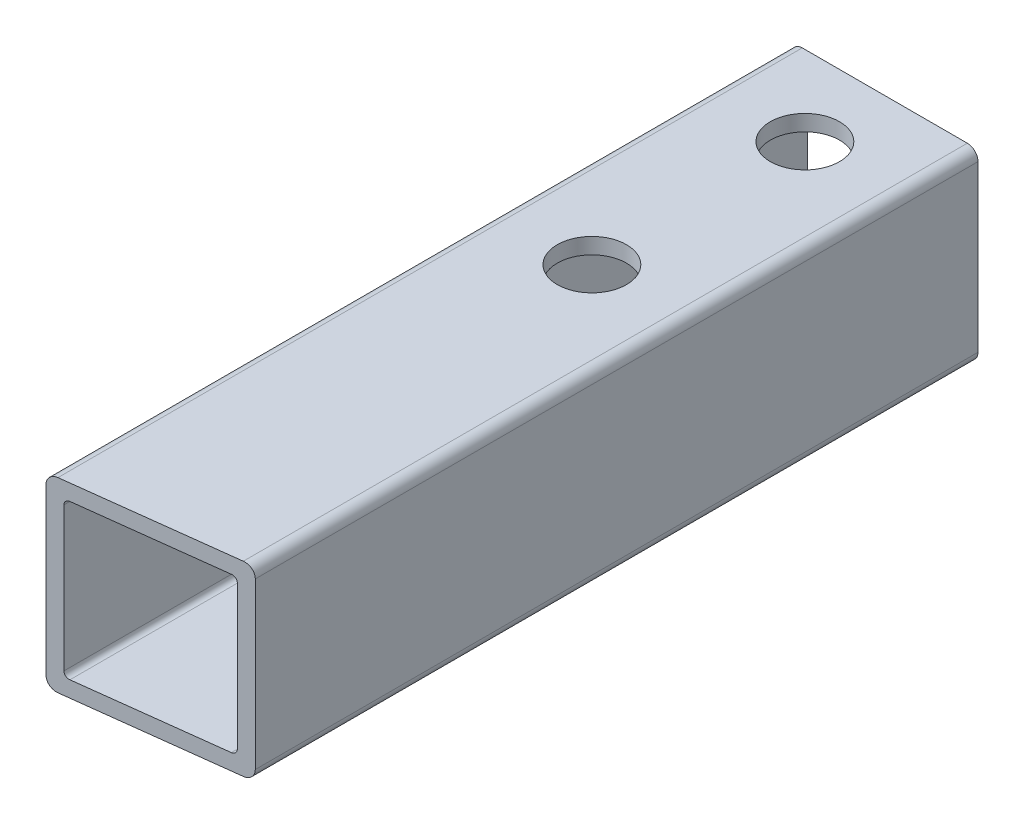
ISO-10303-21;
HEADER;
FILE_DESCRIPTION(('STEP AP214'),'2;1');
FILE_NAME('part.step','',(''),(''),'','','');
FILE_SCHEMA(('AUTOMOTIVE_DESIGN { 1 0 10303 214 1 1 1 1 }'));
ENDSEC;
DATA;
#1=APPLICATION_CONTEXT('core data for automotive mechanical design processes');
#2=APPLICATION_PROTOCOL_DEFINITION('international standard','automotive_design',2000,#1);
#3=PRODUCT_CONTEXT('',#1,'mechanical');
#4=PRODUCT('Part','Part','',(#3));
#5=PRODUCT_RELATED_PRODUCT_CATEGORY('part','',(#4));
#6=PRODUCT_DEFINITION_FORMATION('','',#4);
#7=PRODUCT_DEFINITION_CONTEXT('part definition',#1,'design');
#8=PRODUCT_DEFINITION('design','',#6,#7);
#9=PRODUCT_DEFINITION_SHAPE('','',#8);
#10=(LENGTH_UNIT() NAMED_UNIT(*) SI_UNIT(.MILLI.,.METRE.));
#11=(NAMED_UNIT(*) PLANE_ANGLE_UNIT() SI_UNIT($,.RADIAN.));
#12=(NAMED_UNIT(*) SI_UNIT($,.STERADIAN.) SOLID_ANGLE_UNIT());
#13=UNCERTAINTY_MEASURE_WITH_UNIT(LENGTH_MEASURE(1.E-05),#10,'distance_accuracy_value','');
#14=(GEOMETRIC_REPRESENTATION_CONTEXT(3) GLOBAL_UNCERTAINTY_ASSIGNED_CONTEXT((#13)) GLOBAL_UNIT_ASSIGNED_CONTEXT((#10,
#11,#12)) REPRESENTATION_CONTEXT('',''));
#15=CARTESIAN_POINT('',(0.,0.,0.));
#16=DIRECTION('',(0.,0.,1.));
#17=DIRECTION('',(1.,0.,0.));
#18=AXIS2_PLACEMENT_3D('',#15,#16,#17);
#19=CARTESIAN_POINT('',(-15.5,2.,0.));
#20=DIRECTION('',(0.,0.,1.));
#21=DIRECTION('',(1.,0.,0.));
#22=AXIS2_PLACEMENT_3D('',#19,#20,#21);
#23=PLANE('',#22);
#24=CARTESIAN_POINT('',(-15.5,2.,0.));
#25=DIRECTION('',(0.,0.,1.));
#26=DIRECTION('',(1.,0.,0.));
#27=AXIS2_PLACEMENT_3D('',#24,#25,#26);
#28=CIRCLE('',#27,2.);
#29=CARTESIAN_POINT('',(-17.5,2.,0.));
#30=VERTEX_POINT('',#29);
#31=CARTESIAN_POINT('',(-15.5,0.,0.));
#32=VERTEX_POINT('',#31);
#33=EDGE_CURVE('E255',#30,#32,#28,.T.);
#34=ORIENTED_EDGE('',*,*,#33,.F.);
#35=DIRECTION('',(0.,-1.,0.));
#36=VECTOR('',#35,1.);
#37=CARTESIAN_POINT('',(-17.5,2.,0.));
#38=LINE('',#37,#36);
#39=CARTESIAN_POINT('',(-17.5,33.,0.));
#40=VERTEX_POINT('',#39);
#41=EDGE_CURVE('E259',#40,#30,#38,.T.);
#42=ORIENTED_EDGE('',*,*,#41,.F.);
#43=CARTESIAN_POINT('',(-15.5,33.,0.));
#44=DIRECTION('',(0.,0.,1.));
#45=DIRECTION('',(1.,0.,0.));
#46=AXIS2_PLACEMENT_3D('',#43,#44,#45);
#47=CIRCLE('',#46,2.);
#48=CARTESIAN_POINT('',(-15.5,35.,0.));
#49=VERTEX_POINT('',#48);
#50=EDGE_CURVE('E274',#49,#40,#47,.T.);
#51=ORIENTED_EDGE('',*,*,#50,.F.);
#52=DIRECTION('',(-1.,0.,0.));
#53=VECTOR('',#52,1.);
#54=CARTESIAN_POINT('',(-15.5,35.,0.));
#55=LINE('',#54,#53);
#56=CARTESIAN_POINT('',(15.5,35.,0.));
#57=VERTEX_POINT('',#56);
#58=EDGE_CURVE('E272',#57,#49,#55,.T.);
#59=ORIENTED_EDGE('',*,*,#58,.F.);
#60=CARTESIAN_POINT('',(15.5,33.,0.));
#61=DIRECTION('',(0.,0.,1.));
#62=DIRECTION('',(1.,0.,0.));
#63=AXIS2_PLACEMENT_3D('',#60,#61,#62);
#64=CIRCLE('',#63,2.);
#65=CARTESIAN_POINT('',(17.5,33.,0.));
#66=VERTEX_POINT('',#65);
#67=EDGE_CURVE('E174',#66,#57,#64,.T.);
#68=ORIENTED_EDGE('',*,*,#67,.F.);
#69=DIRECTION('',(0.,1.,0.));
#70=VECTOR('',#69,1.);
#71=CARTESIAN_POINT('',(17.5,2.00000000000001,0.));
#72=LINE('',#71,#70);
#73=CARTESIAN_POINT('',(17.5,2.00000000000001,0.));
#74=VERTEX_POINT('',#73);
#75=EDGE_CURVE('E268',#74,#66,#72,.T.);
#76=ORIENTED_EDGE('',*,*,#75,.F.);
#77=CARTESIAN_POINT('',(15.5,2.00000000000001,0.));
#78=DIRECTION('',(0.,0.,1.));
#79=DIRECTION('',(1.,0.,0.));
#80=AXIS2_PLACEMENT_3D('',#77,#78,#79);
#81=CIRCLE('',#80,2.);
#82=CARTESIAN_POINT('',(15.5,0.,0.));
#83=VERTEX_POINT('',#82);
#84=EDGE_CURVE('E265',#83,#74,#81,.T.);
#85=ORIENTED_EDGE('',*,*,#84,.F.);
#86=DIRECTION('',(1.,0.,0.));
#87=VECTOR('',#86,1.);
#88=CARTESIAN_POINT('',(-15.5,0.,0.));
#89=LINE('',#88,#87);
#90=EDGE_CURVE('E262',#32,#83,#89,.T.);
#91=ORIENTED_EDGE('',*,*,#90,.F.);
#92=EDGE_LOOP('',(#34,#42,#51,#59,#68,#76,#85,#91));
#93=FACE_BOUND('',#92,.T.);
#94=CARTESIAN_POINT('',(-13.5,4.,0.));
#95=DIRECTION('',(0.,0.,1.));
#96=DIRECTION('',(1.,0.,0.));
#97=AXIS2_PLACEMENT_3D('',#94,#95,#96);
#98=CIRCLE('',#97,1.);
#99=CARTESIAN_POINT('',(-14.5,4.,0.));
#100=VERTEX_POINT('',#99);
#101=CARTESIAN_POINT('',(-13.5,3.,0.));
#102=VERTEX_POINT('',#101);
#103=EDGE_CURVE('E216',#100,#102,#98,.T.);
#104=ORIENTED_EDGE('',*,*,#103,.T.);
#105=DIRECTION('',(1.,0.,0.));
#106=VECTOR('',#105,1.);
#107=CARTESIAN_POINT('',(-13.5,3.,0.));
#108=LINE('',#107,#106);
#109=CARTESIAN_POINT('',(13.5,3.,0.));
#110=VERTEX_POINT('',#109);
#111=EDGE_CURVE('E219',#102,#110,#108,.T.);
#112=ORIENTED_EDGE('',*,*,#111,.T.);
#113=CARTESIAN_POINT('',(13.5,4.,0.));
#114=DIRECTION('',(0.,0.,1.));
#115=DIRECTION('',(1.,0.,0.));
#116=AXIS2_PLACEMENT_3D('',#113,#114,#115);
#117=CIRCLE('',#116,1.);
#118=CARTESIAN_POINT('',(14.5,4.,0.));
#119=VERTEX_POINT('',#118);
#120=EDGE_CURVE('E222',#110,#119,#117,.T.);
#121=ORIENTED_EDGE('',*,*,#120,.T.);
#122=DIRECTION('',(0.,1.,0.));
#123=VECTOR('',#122,1.);
#124=CARTESIAN_POINT('',(14.5,4.,0.));
#125=LINE('',#124,#123);
#126=CARTESIAN_POINT('',(14.5,31.,0.));
#127=VERTEX_POINT('',#126);
#128=EDGE_CURVE('E225',#119,#127,#125,.T.);
#129=ORIENTED_EDGE('',*,*,#128,.T.);
#130=CARTESIAN_POINT('',(13.5,31.,0.));
#131=DIRECTION('',(0.,0.,1.));
#132=DIRECTION('',(1.,0.,0.));
#133=AXIS2_PLACEMENT_3D('',#130,#131,#132);
#134=CIRCLE('',#133,1.);
#135=CARTESIAN_POINT('',(13.5,32.,0.));
#136=VERTEX_POINT('',#135);
#137=EDGE_CURVE('E228',#127,#136,#134,.T.);
#138=ORIENTED_EDGE('',*,*,#137,.T.);
#139=DIRECTION('',(-1.,0.,0.));
#140=VECTOR('',#139,1.);
#141=CARTESIAN_POINT('',(-13.5,32.,0.));
#142=LINE('',#141,#140);
#143=CARTESIAN_POINT('',(-13.5,32.,0.));
#144=VERTEX_POINT('',#143);
#145=EDGE_CURVE('E231',#136,#144,#142,.T.);
#146=ORIENTED_EDGE('',*,*,#145,.T.);
#147=CARTESIAN_POINT('',(-13.5,31.,0.));
#148=DIRECTION('',(0.,0.,1.));
#149=DIRECTION('',(1.,0.,0.));
#150=AXIS2_PLACEMENT_3D('',#147,#148,#149);
#151=CIRCLE('',#150,1.);
#152=CARTESIAN_POINT('',(-14.5,31.,0.));
#153=VERTEX_POINT('',#152);
#154=EDGE_CURVE('E234',#144,#153,#151,.T.);
#155=ORIENTED_EDGE('',*,*,#154,.T.);
#156=DIRECTION('',(0.,-1.,0.));
#157=VECTOR('',#156,1.);
#158=CARTESIAN_POINT('',(-14.5,4.,0.));
#159=LINE('',#158,#157);
#160=EDGE_CURVE('E237',#153,#100,#159,.T.);
#161=ORIENTED_EDGE('',*,*,#160,.T.);
#162=EDGE_LOOP('',(#104,#112,#121,#129,#138,#146,#155,#161));
#163=FACE_BOUND('',#162,.T.);
#164=ADVANCED_FACE('F36',(#93,#163),#23,.F.);
#165=CARTESIAN_POINT('',(-15.5,2.,140.));
#166=DIRECTION('',(0.,0.,-1.));
#167=DIRECTION('',(-1.,0.,0.));
#168=AXIS2_PLACEMENT_3D('',#165,#166,#167);
#169=CYLINDRICAL_SURFACE('',#168,2.);
#170=DIRECTION('',(0.,0.,-1.));
#171=VECTOR('',#170,1.);
#172=CARTESIAN_POINT('',(-15.5,0.,140.));
#173=LINE('',#172,#171);
#174=CARTESIAN_POINT('',(-15.5,0.,139.754430878194));
#175=VERTEX_POINT('',#174);
#176=EDGE_CURVE('E45',#175,#32,#173,.T.);
#177=ORIENTED_EDGE('',*,*,#176,.F.);
#178=CARTESIAN_POINT('',(-15.5,2.,139.754430878194));
#179=DIRECTION('',(-0.121869343405148,0.,-0.992546151641322));
#180=DIRECTION('',(0.992546151641322,0.,-0.121869343405148));
#181=AXIS2_PLACEMENT_3D('',#178,#179,#180);
#182=ELLIPSE('',#181,2.0150196509177,2.);
#183=CARTESIAN_POINT('',(-17.5,2.,140.));
#184=VERTEX_POINT('',#183);
#185=EDGE_CURVE('E190',#175,#184,#182,.T.);
#186=ORIENTED_EDGE('',*,*,#185,.T.);
#187=DIRECTION('',(0.,0.,-1.));
#188=VECTOR('',#187,1.);
#189=CARTESIAN_POINT('',(-17.5,2.,140.));
#190=LINE('',#189,#188);
#191=EDGE_CURVE('E258',#184,#30,#190,.T.);
#192=ORIENTED_EDGE('',*,*,#191,.T.);
#193=ORIENTED_EDGE('',*,*,#33,.T.);
#194=EDGE_LOOP('',(#177,#186,#192,#193));
#195=FACE_BOUND('',#194,.T.);
#196=ADVANCED_FACE('F38',(#195),#169,.T.);
#197=CARTESIAN_POINT('',(-15.5,0.,140.));
#198=DIRECTION('',(0.,1.,0.));
#199=DIRECTION('',(-1.,0.,0.));
#200=AXIS2_PLACEMENT_3D('',#197,#198,#199);
#201=PLANE('',#200);
#202=CARTESIAN_POINT('',(0.,0.,15.));
#203=DIRECTION('',(0.,1.,0.));
#204=DIRECTION('',(-1.,0.,0.));
#205=AXIS2_PLACEMENT_3D('',#202,#203,#204);
#206=CIRCLE('',#205,6.5);
#207=CARTESIAN_POINT('',(-6.5,0.,15.));
#208=VERTEX_POINT('',#207);
#209=EDGE_CURVE('E213',#208,#208,#206,.T.);
#210=ORIENTED_EDGE('',*,*,#209,.T.);
#211=EDGE_LOOP('',(#210));
#212=FACE_BOUND('',#211,.T.);
#213=CARTESIAN_POINT('',(0.,0.,55.));
#214=DIRECTION('',(0.,1.,0.));
#215=DIRECTION('',(-1.,0.,0.));
#216=AXIS2_PLACEMENT_3D('',#213,#214,#215);
#217=CIRCLE('',#216,6.5);
#218=CARTESIAN_POINT('',(-6.5,0.,55.));
#219=VERTEX_POINT('',#218);
#220=EDGE_CURVE('E194',#219,#219,#217,.T.);
#221=ORIENTED_EDGE('',*,*,#220,.T.);
#222=EDGE_LOOP('',(#221));
#223=FACE_BOUND('',#222,.T.);
#224=DIRECTION('',(0.,0.,-1.));
#225=VECTOR('',#224,1.);
#226=CARTESIAN_POINT('',(15.5,0.,140.));
#227=LINE('',#226,#225);
#228=CARTESIAN_POINT('',(15.5,0.,135.948109490204));
#229=VERTEX_POINT('',#228);
#230=EDGE_CURVE('E185',#229,#83,#227,.T.);
#231=ORIENTED_EDGE('',*,*,#230,.F.);
#232=DIRECTION('',(-0.992546151641322,0.,0.121869343405148));
#233=VECTOR('',#232,1.);
#234=CARTESIAN_POINT('',(-15.529704273724,0.,139.7580781044));
#235=LINE('',#234,#233);
#236=EDGE_CURVE('E197',#229,#175,#235,.T.);
#237=ORIENTED_EDGE('',*,*,#236,.T.);
#238=ORIENTED_EDGE('',*,*,#176,.T.);
#239=ORIENTED_EDGE('',*,*,#90,.T.);
#240=EDGE_LOOP('',(#231,#237,#238,#239));
#241=FACE_BOUND('',#240,.T.);
#242=ADVANCED_FACE('F292',(#212,#223,#241),#201,.F.);
#243=CARTESIAN_POINT('',(15.5,2.00000000000001,140.));
#244=DIRECTION('',(0.,0.,-1.));
#245=DIRECTION('',(-1.,0.,0.));
#246=AXIS2_PLACEMENT_3D('',#243,#244,#245);
#247=CYLINDRICAL_SURFACE('',#246,2.);
#248=DIRECTION('',(0.,0.,-1.));
#249=VECTOR('',#248,1.);
#250=CARTESIAN_POINT('',(17.5,2.00000000000001,140.));
#251=LINE('',#250,#249);
#252=CARTESIAN_POINT('',(17.5,2.00000000000001,135.702540368398));
#253=VERTEX_POINT('',#252);
#254=EDGE_CURVE('E178',#253,#74,#251,.T.);
#255=ORIENTED_EDGE('',*,*,#254,.F.);
#256=CARTESIAN_POINT('',(15.5,2.00000000000001,135.948109490204));
#257=DIRECTION('',(-0.121869343405148,0.,-0.992546151641322));
#258=DIRECTION('',(0.992546151641322,0.,-0.121869343405148));
#259=AXIS2_PLACEMENT_3D('',#256,#257,#258);
#260=ELLIPSE('',#259,2.0150196509177,2.);
#261=EDGE_CURVE('E204',#253,#229,#260,.T.);
#262=ORIENTED_EDGE('',*,*,#261,.T.);
#263=ORIENTED_EDGE('',*,*,#230,.T.);
#264=ORIENTED_EDGE('',*,*,#84,.T.);
#265=EDGE_LOOP('',(#255,#262,#263,#264));
#266=FACE_BOUND('',#265,.T.);
#267=ADVANCED_FACE('F296',(#266),#247,.T.);
#268=CARTESIAN_POINT('',(17.5,2.00000000000001,140.));
#269=DIRECTION('',(-1.,0.,0.));
#270=DIRECTION('',(0.,0.,1.));
#271=AXIS2_PLACEMENT_3D('',#268,#269,#270);
#272=PLANE('',#271);
#273=DIRECTION('',(0.,0.,-1.));
#274=VECTOR('',#273,1.);
#275=CARTESIAN_POINT('',(17.5,33.,140.));
#276=LINE('',#275,#274);
#277=CARTESIAN_POINT('',(17.5,33.,135.702540368398));
#278=VERTEX_POINT('',#277);
#279=EDGE_CURVE('E176',#278,#66,#276,.T.);
#280=ORIENTED_EDGE('',*,*,#279,.F.);
#281=DIRECTION('',(0.,-1.,0.));
#282=VECTOR('',#281,1.);
#283=CARTESIAN_POINT('',(17.5,2.00000000000001,135.702540368398));
#284=LINE('',#283,#282);
#285=EDGE_CURVE('E156',#278,#253,#284,.T.);
#286=ORIENTED_EDGE('',*,*,#285,.T.);
#287=ORIENTED_EDGE('',*,*,#254,.T.);
#288=ORIENTED_EDGE('',*,*,#75,.T.);
#289=EDGE_LOOP('',(#280,#286,#287,#288));
#290=FACE_BOUND('',#289,.T.);
#291=ADVANCED_FACE('F357',(#290),#272,.F.);
#292=CARTESIAN_POINT('',(15.5,33.,140.));
#293=DIRECTION('',(0.,0.,-1.));
#294=DIRECTION('',(-1.,0.,0.));
#295=AXIS2_PLACEMENT_3D('',#292,#293,#294);
#296=CYLINDRICAL_SURFACE('',#295,2.);
#297=DIRECTION('',(0.,0.,-1.));
#298=VECTOR('',#297,1.);
#299=CARTESIAN_POINT('',(15.5,35.,140.));
#300=LINE('',#299,#298);
#301=CARTESIAN_POINT('',(15.5,35.,135.948109490204));
#302=VERTEX_POINT('',#301);
#303=EDGE_CURVE('E166',#302,#57,#300,.T.);
#304=ORIENTED_EDGE('',*,*,#303,.F.);
#305=CARTESIAN_POINT('',(15.5,33.,135.948109490204));
#306=DIRECTION('',(-0.121869343405148,0.,-0.992546151641322));
#307=DIRECTION('',(0.992546151641322,0.,-0.121869343405148));
#308=AXIS2_PLACEMENT_3D('',#305,#306,#307);
#309=ELLIPSE('',#308,2.01501965091769,2.);
#310=EDGE_CURVE('E150',#302,#278,#309,.T.);
#311=ORIENTED_EDGE('',*,*,#310,.T.);
#312=ORIENTED_EDGE('',*,*,#279,.T.);
#313=ORIENTED_EDGE('',*,*,#67,.T.);
#314=EDGE_LOOP('',(#304,#311,#312,#313));
#315=FACE_BOUND('',#314,.T.);
#316=ADVANCED_FACE('F172',(#315),#296,.T.);
#317=CARTESIAN_POINT('',(-15.5,35.,140.));
#318=DIRECTION('',(0.,-1.,0.));
#319=DIRECTION('',(1.,0.,0.));
#320=AXIS2_PLACEMENT_3D('',#317,#318,#319);
#321=PLANE('',#320);
#322=CARTESIAN_POINT('',(0.,35.,15.));
#323=DIRECTION('',(0.,1.,0.));
#324=DIRECTION('',(-1.,0.,0.));
#325=AXIS2_PLACEMENT_3D('',#322,#323,#324);
#326=CIRCLE('',#325,6.5);
#327=CARTESIAN_POINT('',(-6.50000000000001,35.,15.));
#328=VERTEX_POINT('',#327);
#329=EDGE_CURVE('E170',#328,#328,#326,.T.);
#330=ORIENTED_EDGE('',*,*,#329,.F.);
#331=EDGE_LOOP('',(#330));
#332=FACE_BOUND('',#331,.T.);
#333=CARTESIAN_POINT('',(0.,35.,55.));
#334=DIRECTION('',(0.,1.,0.));
#335=DIRECTION('',(-1.,0.,0.));
#336=AXIS2_PLACEMENT_3D('',#333,#334,#335);
#337=CIRCLE('',#336,6.5);
#338=CARTESIAN_POINT('',(-6.5,35.,55.));
#339=VERTEX_POINT('',#338);
#340=EDGE_CURVE('E312',#339,#339,#337,.T.);
#341=ORIENTED_EDGE('',*,*,#340,.F.);
#342=EDGE_LOOP('',(#341));
#343=FACE_BOUND('',#342,.T.);
#344=DIRECTION('',(0.,0.,-1.));
#345=VECTOR('',#344,1.);
#346=CARTESIAN_POINT('',(-15.5,35.,140.));
#347=LINE('',#346,#345);
#348=CARTESIAN_POINT('',(-15.5,35.,139.754430878194));
#349=VERTEX_POINT('',#348);
#350=EDGE_CURVE('E168',#349,#49,#347,.T.);
#351=ORIENTED_EDGE('',*,*,#350,.F.);
#352=DIRECTION('',(-0.992546151641322,0.,0.121869343405148));
#353=VECTOR('',#352,1.);
#354=CARTESIAN_POINT('',(-17.5,35.,140.));
#355=LINE('',#354,#353);
#356=EDGE_CURVE('E153',#302,#349,#355,.T.);
#357=ORIENTED_EDGE('',*,*,#356,.F.);
#358=ORIENTED_EDGE('',*,*,#303,.T.);
#359=ORIENTED_EDGE('',*,*,#58,.T.);
#360=EDGE_LOOP('',(#351,#357,#358,#359));
#361=FACE_BOUND('',#360,.T.);
#362=ADVANCED_FACE('F164',(#332,#343,#361),#321,.F.);
#363=CARTESIAN_POINT('',(-15.5,33.,140.));
#364=DIRECTION('',(0.,0.,-1.));
#365=DIRECTION('',(-1.,0.,0.));
#366=AXIS2_PLACEMENT_3D('',#363,#364,#365);
#367=CYLINDRICAL_SURFACE('',#366,2.);
#368=DIRECTION('',(0.,0.,-1.));
#369=VECTOR('',#368,1.);
#370=CARTESIAN_POINT('',(-17.5,33.,140.));
#371=LINE('',#370,#369);
#372=CARTESIAN_POINT('',(-17.5,33.,140.));
#373=VERTEX_POINT('',#372);
#374=EDGE_CURVE('E180',#373,#40,#371,.T.);
#375=ORIENTED_EDGE('',*,*,#374,.F.);
#376=CARTESIAN_POINT('',(-15.5,33.,139.754430878194));
#377=DIRECTION('',(-0.121869343405148,0.,-0.992546151641322));
#378=DIRECTION('',(0.992546151641322,0.,-0.121869343405148));
#379=AXIS2_PLACEMENT_3D('',#376,#377,#378);
#380=ELLIPSE('',#379,2.01501965091769,2.);
#381=EDGE_CURVE('E160',#373,#349,#380,.T.);
#382=ORIENTED_EDGE('',*,*,#381,.T.);
#383=ORIENTED_EDGE('',*,*,#350,.T.);
#384=ORIENTED_EDGE('',*,*,#50,.T.);
#385=EDGE_LOOP('',(#375,#382,#383,#384));
#386=FACE_BOUND('',#385,.T.);
#387=ADVANCED_FACE('F322',(#386),#367,.T.);
#388=CARTESIAN_POINT('',(-17.5,2.,140.));
#389=DIRECTION('',(1.,0.,0.));
#390=DIRECTION('',(0.,1.,0.));
#391=AXIS2_PLACEMENT_3D('',#388,#389,#390);
#392=PLANE('',#391);
#393=ORIENTED_EDGE('',*,*,#41,.T.);
#394=ORIENTED_EDGE('',*,*,#191,.F.);
#395=DIRECTION('',(0.,-1.,0.));
#396=VECTOR('',#395,1.);
#397=CARTESIAN_POINT('',(-17.5,2.,140.));
#398=LINE('',#397,#396);
#399=EDGE_CURVE('E256',#373,#184,#398,.T.);
#400=ORIENTED_EDGE('',*,*,#399,.F.);
#401=ORIENTED_EDGE('',*,*,#374,.T.);
#402=EDGE_LOOP('',(#393,#394,#400,#401));
#403=FACE_BOUND('',#402,.T.);
#404=ADVANCED_FACE('F282',(#403),#392,.F.);
#405=CARTESIAN_POINT('',(-13.5,4.,140.));
#406=DIRECTION('',(0.,0.,-1.));
#407=DIRECTION('',(-1.,0.,0.));
#408=AXIS2_PLACEMENT_3D('',#405,#406,#407);
#409=CYLINDRICAL_SURFACE('',#408,1.);
#410=CARTESIAN_POINT('',(-13.5,4.,139.508861756388));
#411=DIRECTION('',(-0.121869343405148,0.,-0.992546151641322));
#412=DIRECTION('',(0.992546151641322,0.,-0.121869343405148));
#413=AXIS2_PLACEMENT_3D('',#410,#411,#412);
#414=ELLIPSE('',#413,1.00750982545885,1.);
#415=CARTESIAN_POINT('',(-13.5,3.,139.508861756388));
#416=VERTEX_POINT('',#415);
#417=CARTESIAN_POINT('',(-14.5,4.,139.631646317291));
#418=VERTEX_POINT('',#417);
#419=EDGE_CURVE('E52',#416,#418,#414,.T.);
#420=ORIENTED_EDGE('',*,*,#419,.F.);
#421=DIRECTION('',(0.,0.,-1.));
#422=VECTOR('',#421,1.);
#423=CARTESIAN_POINT('',(-13.5,3.,140.));
#424=LINE('',#423,#422);
#425=EDGE_CURVE('E253',#416,#102,#424,.T.);
#426=ORIENTED_EDGE('',*,*,#425,.T.);
#427=ORIENTED_EDGE('',*,*,#103,.F.);
#428=DIRECTION('',(0.,0.,-1.));
#429=VECTOR('',#428,1.);
#430=CARTESIAN_POINT('',(-14.5,4.,140.));
#431=LINE('',#430,#429);
#432=EDGE_CURVE('E59',#418,#100,#431,.T.);
#433=ORIENTED_EDGE('',*,*,#432,.F.);
#434=EDGE_LOOP('',(#420,#426,#427,#433));
#435=FACE_BOUND('',#434,.T.);
#436=ADVANCED_FACE('F349',(#435),#409,.F.);
#437=CARTESIAN_POINT('',(-13.5,3.,140.));
#438=DIRECTION('',(0.,1.,0.));
#439=DIRECTION('',(0.,0.,1.));
#440=AXIS2_PLACEMENT_3D('',#437,#438,#439);
#441=PLANE('',#440);
#442=DIRECTION('',(-0.992546151641322,0.,0.121869343405148));
#443=VECTOR('',#442,1.);
#444=CARTESIAN_POINT('',(-13.559408547448,3.,139.516156208801));
#445=LINE('',#444,#443);
#446=CARTESIAN_POINT('',(13.5,3.,136.19367861201));
#447=VERTEX_POINT('',#446);
#448=EDGE_CURVE('E301',#447,#416,#445,.T.);
#449=ORIENTED_EDGE('',*,*,#448,.F.);
#450=DIRECTION('',(0.,0.,-1.));
#451=VECTOR('',#450,1.);
#452=CARTESIAN_POINT('',(13.5,3.,140.));
#453=LINE('',#452,#451);
#454=EDGE_CURVE('E251',#447,#110,#453,.T.);
#455=ORIENTED_EDGE('',*,*,#454,.T.);
#456=ORIENTED_EDGE('',*,*,#111,.F.);
#457=ORIENTED_EDGE('',*,*,#425,.F.);
#458=EDGE_LOOP('',(#449,#455,#456,#457));
#459=FACE_BOUND('',#458,.T.);
#460=CARTESIAN_POINT('',(0.,3.,15.));
#461=DIRECTION('',(0.,1.,0.));
#462=DIRECTION('',(0.,0.,1.));
#463=AXIS2_PLACEMENT_3D('',#460,#461,#462);
#464=CIRCLE('',#463,6.5);
#465=CARTESIAN_POINT('',(0.,3.,21.5));
#466=VERTEX_POINT('',#465);
#467=EDGE_CURVE('E210',#466,#466,#464,.T.);
#468=ORIENTED_EDGE('',*,*,#467,.F.);
#469=EDGE_LOOP('',(#468));
#470=FACE_BOUND('',#469,.T.);
#471=CARTESIAN_POINT('',(0.,3.,55.));
#472=DIRECTION('',(0.,1.,0.));
#473=DIRECTION('',(0.,0.,1.));
#474=AXIS2_PLACEMENT_3D('',#471,#472,#473);
#475=CIRCLE('',#474,6.5);
#476=CARTESIAN_POINT('',(0.,3.,61.5));
#477=VERTEX_POINT('',#476);
#478=EDGE_CURVE('E189',#477,#477,#475,.T.);
#479=ORIENTED_EDGE('',*,*,#478,.F.);
#480=EDGE_LOOP('',(#479));
#481=FACE_BOUND('',#480,.T.);
#482=ADVANCED_FACE('F377',(#459,#470,#481),#441,.T.);
#483=CARTESIAN_POINT('',(13.5,4.,140.));
#484=DIRECTION('',(0.,0.,-1.));
#485=DIRECTION('',(-1.,0.,0.));
#486=AXIS2_PLACEMENT_3D('',#483,#484,#485);
#487=CYLINDRICAL_SURFACE('',#486,1.);
#488=CARTESIAN_POINT('',(13.5,4.,136.19367861201));
#489=DIRECTION('',(-0.121869343405148,0.,-0.992546151641322));
#490=DIRECTION('',(0.992546151641322,0.,-0.121869343405148));
#491=AXIS2_PLACEMENT_3D('',#488,#489,#490);
#492=ELLIPSE('',#491,1.00750982545885,1.);
#493=CARTESIAN_POINT('',(14.5,4.,136.070894051107));
#494=VERTEX_POINT('',#493);
#495=EDGE_CURVE('E303',#494,#447,#492,.T.);
#496=ORIENTED_EDGE('',*,*,#495,.F.);
#497=DIRECTION('',(0.,0.,-1.));
#498=VECTOR('',#497,1.);
#499=CARTESIAN_POINT('',(14.5,4.,140.));
#500=LINE('',#499,#498);
#501=EDGE_CURVE('E249',#494,#119,#500,.T.);
#502=ORIENTED_EDGE('',*,*,#501,.T.);
#503=ORIENTED_EDGE('',*,*,#120,.F.);
#504=ORIENTED_EDGE('',*,*,#454,.F.);
#505=EDGE_LOOP('',(#496,#502,#503,#504));
#506=FACE_BOUND('',#505,.T.);
#507=ADVANCED_FACE('F380',(#506),#487,.F.);
#508=CARTESIAN_POINT('',(14.5,4.,140.));
#509=DIRECTION('',(-1.,0.,0.));
#510=DIRECTION('',(0.,0.,1.));
#511=AXIS2_PLACEMENT_3D('',#508,#509,#510);
#512=PLANE('',#511);
#513=DIRECTION('',(0.,-1.,0.));
#514=VECTOR('',#513,1.);
#515=CARTESIAN_POINT('',(14.5,4.,136.070894051107));
#516=LINE('',#515,#514);
#517=CARTESIAN_POINT('',(14.5,31.,136.070894051107));
#518=VERTEX_POINT('',#517);
#519=EDGE_CURVE('E305',#518,#494,#516,.T.);
#520=ORIENTED_EDGE('',*,*,#519,.F.);
#521=DIRECTION('',(0.,0.,-1.));
#522=VECTOR('',#521,1.);
#523=CARTESIAN_POINT('',(14.5,31.,140.));
#524=LINE('',#523,#522);
#525=EDGE_CURVE('E247',#518,#127,#524,.T.);
#526=ORIENTED_EDGE('',*,*,#525,.T.);
#527=ORIENTED_EDGE('',*,*,#128,.F.);
#528=ORIENTED_EDGE('',*,*,#501,.F.);
#529=EDGE_LOOP('',(#520,#526,#527,#528));
#530=FACE_BOUND('',#529,.T.);
#531=ADVANCED_FACE('F387',(#530),#512,.T.);
#532=CARTESIAN_POINT('',(13.5,31.,140.));
#533=DIRECTION('',(0.,0.,-1.));
#534=DIRECTION('',(-1.,0.,0.));
#535=AXIS2_PLACEMENT_3D('',#532,#533,#534);
#536=CYLINDRICAL_SURFACE('',#535,1.);
#537=CARTESIAN_POINT('',(13.5,31.,136.19367861201));
#538=DIRECTION('',(-0.121869343405148,0.,-0.992546151641322));
#539=DIRECTION('',(0.992546151641322,0.,-0.121869343405148));
#540=AXIS2_PLACEMENT_3D('',#537,#538,#539);
#541=ELLIPSE('',#540,1.00750982545885,1.);
#542=CARTESIAN_POINT('',(13.5,32.,136.19367861201));
#543=VERTEX_POINT('',#542);
#544=EDGE_CURVE('E307',#543,#518,#541,.T.);
#545=ORIENTED_EDGE('',*,*,#544,.F.);
#546=DIRECTION('',(0.,0.,-1.));
#547=VECTOR('',#546,1.);
#548=CARTESIAN_POINT('',(13.5,32.,140.));
#549=LINE('',#548,#547);
#550=EDGE_CURVE('E245',#543,#136,#549,.T.);
#551=ORIENTED_EDGE('',*,*,#550,.T.);
#552=ORIENTED_EDGE('',*,*,#137,.F.);
#553=ORIENTED_EDGE('',*,*,#525,.F.);
#554=EDGE_LOOP('',(#545,#551,#552,#553));
#555=FACE_BOUND('',#554,.T.);
#556=ADVANCED_FACE('F395',(#555),#536,.F.);
#557=CARTESIAN_POINT('',(-13.5,32.,140.));
#558=DIRECTION('',(0.,-1.,0.));
#559=DIRECTION('',(0.,0.,-1.));
#560=AXIS2_PLACEMENT_3D('',#557,#558,#559);
#561=PLANE('',#560);
#562=DIRECTION('',(0.992546151641322,0.,-0.121869343405148));
#563=VECTOR('',#562,1.);
#564=CARTESIAN_POINT('',(-13.559408547448,32.,139.516156208801));
#565=LINE('',#564,#563);
#566=CARTESIAN_POINT('',(-13.5,32.,139.508861756388));
#567=VERTEX_POINT('',#566);
#568=EDGE_CURVE('E309',#567,#543,#565,.T.);
#569=ORIENTED_EDGE('',*,*,#568,.F.);
#570=DIRECTION('',(0.,0.,-1.));
#571=VECTOR('',#570,1.);
#572=CARTESIAN_POINT('',(-13.5,32.,140.));
#573=LINE('',#572,#571);
#574=EDGE_CURVE('E243',#567,#144,#573,.T.);
#575=ORIENTED_EDGE('',*,*,#574,.T.);
#576=ORIENTED_EDGE('',*,*,#145,.F.);
#577=ORIENTED_EDGE('',*,*,#550,.F.);
#578=EDGE_LOOP('',(#569,#575,#576,#577));
#579=FACE_BOUND('',#578,.T.);
#580=CARTESIAN_POINT('',(0.,32.,15.));
#581=DIRECTION('',(0.,-1.,0.));
#582=DIRECTION('',(0.,0.,-1.));
#583=AXIS2_PLACEMENT_3D('',#580,#581,#582);
#584=CIRCLE('',#583,6.5);
#585=CARTESIAN_POINT('',(0.,32.,8.5));
#586=VERTEX_POINT('',#585);
#587=EDGE_CURVE('E40',#586,#586,#584,.T.);
#588=ORIENTED_EDGE('',*,*,#587,.F.);
#589=EDGE_LOOP('',(#588));
#590=FACE_BOUND('',#589,.T.);
#591=CARTESIAN_POINT('',(0.,32.,55.));
#592=DIRECTION('',(0.,-1.,0.));
#593=DIRECTION('',(0.,0.,-1.));
#594=AXIS2_PLACEMENT_3D('',#591,#592,#593);
#595=CIRCLE('',#594,6.5);
#596=CARTESIAN_POINT('',(0.,32.,48.5));
#597=VERTEX_POINT('',#596);
#598=EDGE_CURVE('E187',#597,#597,#595,.T.);
#599=ORIENTED_EDGE('',*,*,#598,.F.);
#600=EDGE_LOOP('',(#599));
#601=FACE_BOUND('',#600,.T.);
#602=ADVANCED_FACE('F399',(#579,#590,#601),#561,.T.);
#603=CARTESIAN_POINT('',(-13.5,31.,140.));
#604=DIRECTION('',(0.,0.,-1.));
#605=DIRECTION('',(-1.,0.,0.));
#606=AXIS2_PLACEMENT_3D('',#603,#604,#605);
#607=CYLINDRICAL_SURFACE('',#606,1.);
#608=CARTESIAN_POINT('',(-13.5,31.,139.508861756388));
#609=DIRECTION('',(-0.121869343405148,0.,-0.992546151641322));
#610=DIRECTION('',(0.992546151641322,0.,-0.121869343405148));
#611=AXIS2_PLACEMENT_3D('',#608,#609,#610);
#612=ELLIPSE('',#611,1.00750982545885,1.);
#613=CARTESIAN_POINT('',(-14.5,31.,139.631646317291));
#614=VERTEX_POINT('',#613);
#615=EDGE_CURVE('E169',#614,#567,#612,.T.);
#616=ORIENTED_EDGE('',*,*,#615,.F.);
#617=DIRECTION('',(0.,0.,-1.));
#618=VECTOR('',#617,1.);
#619=CARTESIAN_POINT('',(-14.5,31.,140.));
#620=LINE('',#619,#618);
#621=EDGE_CURVE('E241',#614,#153,#620,.T.);
#622=ORIENTED_EDGE('',*,*,#621,.T.);
#623=ORIENTED_EDGE('',*,*,#154,.F.);
#624=ORIENTED_EDGE('',*,*,#574,.F.);
#625=EDGE_LOOP('',(#616,#622,#623,#624));
#626=FACE_BOUND('',#625,.T.);
#627=ADVANCED_FACE('F403',(#626),#607,.F.);
#628=CARTESIAN_POINT('',(-14.5,4.,140.));
#629=DIRECTION('',(1.,0.,0.));
#630=DIRECTION('',(0.,1.,0.));
#631=AXIS2_PLACEMENT_3D('',#628,#629,#630);
#632=PLANE('',#631);
#633=DIRECTION('',(0.,1.,0.));
#634=VECTOR('',#633,1.);
#635=CARTESIAN_POINT('',(-14.5,4.,139.631646317291));
#636=LINE('',#635,#634);
#637=EDGE_CURVE('E11',#418,#614,#636,.T.);
#638=ORIENTED_EDGE('',*,*,#637,.F.);
#639=ORIENTED_EDGE('',*,*,#432,.T.);
#640=ORIENTED_EDGE('',*,*,#160,.F.);
#641=ORIENTED_EDGE('',*,*,#621,.F.);
#642=EDGE_LOOP('',(#638,#639,#640,#641));
#643=FACE_BOUND('',#642,.T.);
#644=ADVANCED_FACE('F337',(#643),#632,.T.);
#645=CARTESIAN_POINT('',(-17.5,-105.,140.));
#646=DIRECTION('',(-0.121869343405148,0.,-0.992546151641322));
#647=DIRECTION('',(-0.992546151641322,0.,0.121869343405148));
#648=AXIS2_PLACEMENT_3D('',#645,#646,#647);
#649=PLANE('',#648);
#650=ORIENTED_EDGE('',*,*,#419,.T.);
#651=ORIENTED_EDGE('',*,*,#637,.T.);
#652=ORIENTED_EDGE('',*,*,#615,.T.);
#653=ORIENTED_EDGE('',*,*,#568,.T.);
#654=ORIENTED_EDGE('',*,*,#544,.T.);
#655=ORIENTED_EDGE('',*,*,#519,.T.);
#656=ORIENTED_EDGE('',*,*,#495,.T.);
#657=ORIENTED_EDGE('',*,*,#448,.T.);
#658=EDGE_LOOP('',(#650,#651,#652,#653,#654,#655,#656,#657));
#659=FACE_BOUND('',#658,.T.);
#660=ORIENTED_EDGE('',*,*,#236,.F.);
#661=ORIENTED_EDGE('',*,*,#261,.F.);
#662=ORIENTED_EDGE('',*,*,#285,.F.);
#663=ORIENTED_EDGE('',*,*,#310,.F.);
#664=ORIENTED_EDGE('',*,*,#356,.T.);
#665=ORIENTED_EDGE('',*,*,#381,.F.);
#666=ORIENTED_EDGE('',*,*,#399,.T.);
#667=ORIENTED_EDGE('',*,*,#185,.F.);
#668=EDGE_LOOP('',(#660,#661,#662,#663,#664,#665,#666,#667));
#669=FACE_BOUND('',#668,.T.);
#670=ADVANCED_FACE('F152',(#659,#669),#649,.F.);
#671=CARTESIAN_POINT('',(0.,-105.,55.));
#672=DIRECTION('',(0.,1.,0.));
#673=DIRECTION('',(-1.,0.,0.));
#674=AXIS2_PLACEMENT_3D('',#671,#672,#673);
#675=CYLINDRICAL_SURFACE('',#674,6.5);
#676=ORIENTED_EDGE('',*,*,#598,.T.);
#677=EDGE_LOOP('',(#676));
#678=FACE_BOUND('',#677,.T.);
#679=ORIENTED_EDGE('',*,*,#340,.T.);
#680=EDGE_LOOP('',(#679));
#681=FACE_BOUND('',#680,.T.);
#682=ADVANCED_FACE('F326',(#678,#681),#675,.F.);
#683=CARTESIAN_POINT('',(0.,-105.,15.));
#684=DIRECTION('',(0.,1.,0.));
#685=DIRECTION('',(-1.,0.,0.));
#686=AXIS2_PLACEMENT_3D('',#683,#684,#685);
#687=CYLINDRICAL_SURFACE('',#686,6.5);
#688=ORIENTED_EDGE('',*,*,#587,.T.);
#689=EDGE_LOOP('',(#688));
#690=FACE_BOUND('',#689,.T.);
#691=ORIENTED_EDGE('',*,*,#329,.T.);
#692=EDGE_LOOP('',(#691));
#693=FACE_BOUND('',#692,.T.);
#694=ADVANCED_FACE('F318',(#690,#693),#687,.F.);
#695=ORIENTED_EDGE('',*,*,#478,.T.);
#696=EDGE_LOOP('',(#695));
#697=FACE_BOUND('',#696,.T.);
#698=ORIENTED_EDGE('',*,*,#220,.F.);
#699=EDGE_LOOP('',(#698));
#700=FACE_BOUND('',#699,.T.);
#701=ADVANCED_FACE('F329',(#697,#700),#675,.F.);
#702=ORIENTED_EDGE('',*,*,#467,.T.);
#703=EDGE_LOOP('',(#702));
#704=FACE_BOUND('',#703,.T.);
#705=ORIENTED_EDGE('',*,*,#209,.F.);
#706=EDGE_LOOP('',(#705));
#707=FACE_BOUND('',#706,.T.);
#708=ADVANCED_FACE('F336',(#704,#707),#687,.F.);
#709=CLOSED_SHELL('',(#164,#196,#242,#267,#291,#316,#362,#387,#404,#436,#482,#507,#531,#556,
#602,#627,#644,#670,#682,#694,#701,#708));
#710=MANIFOLD_SOLID_BREP('B2',#709);
#711=ADVANCED_BREP_SHAPE_REPRESENTATION('',(#18,#710),#14);
#712=SHAPE_DEFINITION_REPRESENTATION(#9,#711);
ENDSEC;
END-ISO-10303-21;
